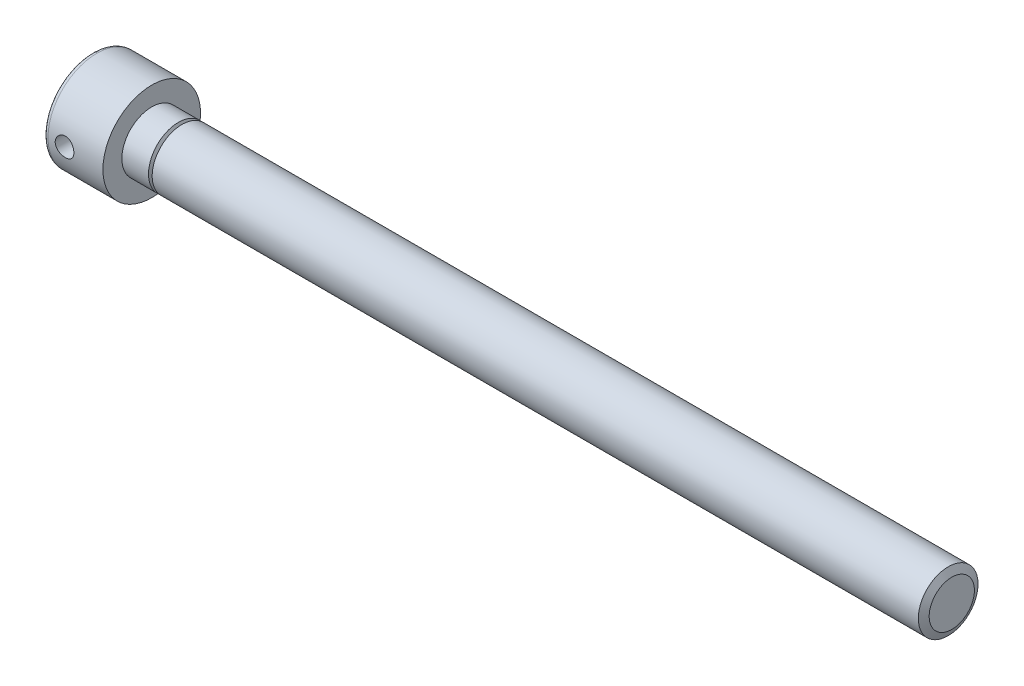
ISO-10303-21;
HEADER;
FILE_DESCRIPTION(('STEP AP214'),'2;1');
FILE_NAME('part.step','',(''),(''),'','','');
FILE_SCHEMA(('AUTOMOTIVE_DESIGN { 1 0 10303 214 1 1 1 1 }'));
ENDSEC;
DATA;
#1=APPLICATION_CONTEXT('core data for automotive mechanical design processes');
#2=APPLICATION_PROTOCOL_DEFINITION('international standard','automotive_design',2000,#1);
#3=PRODUCT_CONTEXT('',#1,'mechanical');
#4=PRODUCT('Part','Part','',(#3));
#5=PRODUCT_RELATED_PRODUCT_CATEGORY('part','',(#4));
#6=PRODUCT_DEFINITION_FORMATION('','',#4);
#7=PRODUCT_DEFINITION_CONTEXT('part definition',#1,'design');
#8=PRODUCT_DEFINITION('design','',#6,#7);
#9=PRODUCT_DEFINITION_SHAPE('','',#8);
#10=(LENGTH_UNIT() NAMED_UNIT(*) SI_UNIT(.MILLI.,.METRE.));
#11=(NAMED_UNIT(*) PLANE_ANGLE_UNIT() SI_UNIT($,.RADIAN.));
#12=(NAMED_UNIT(*) SI_UNIT($,.STERADIAN.) SOLID_ANGLE_UNIT());
#13=UNCERTAINTY_MEASURE_WITH_UNIT(LENGTH_MEASURE(1.E-05),#10,'distance_accuracy_value','');
#14=(GEOMETRIC_REPRESENTATION_CONTEXT(3) GLOBAL_UNCERTAINTY_ASSIGNED_CONTEXT((#13)) GLOBAL_UNIT_ASSIGNED_CONTEXT((#10,
#11,#12)) REPRESENTATION_CONTEXT('',''));
#15=CARTESIAN_POINT('',(0.,0.,0.));
#16=DIRECTION('',(0.,0.,1.));
#17=DIRECTION('',(1.,0.,0.));
#18=AXIS2_PLACEMENT_3D('',#15,#16,#17);
#19=CARTESIAN_POINT('',(-2.8448,0.,0.));
#20=DIRECTION('',(-1.,0.,0.));
#21=DIRECTION('',(0.,0.,1.));
#22=AXIS2_PLACEMENT_3D('',#19,#20,#21);
#23=PLANE('',#22);
#24=CARTESIAN_POINT('',(-2.8448,0.,0.));
#25=DIRECTION('',(-1.,0.,0.));
#26=DIRECTION('',(0.,0.,1.));
#27=AXIS2_PLACEMENT_3D('',#24,#25,#26);
#28=CIRCLE('',#27,2.0955);
#29=CARTESIAN_POINT('',(-2.8448,0.,2.0955));
#30=VERTEX_POINT('',#29);
#31=EDGE_CURVE('E107',#30,#30,#28,.T.);
#32=ORIENTED_EDGE('',*,*,#31,.T.);
#33=EDGE_LOOP('',(#32));
#34=FACE_BOUND('',#33,.T.);
#35=DIRECTION('',(0.,-1.,0.));
#36=VECTOR('',#35,1.);
#37=CARTESIAN_POINT('',(-2.8448,0.,1.1938));
#38=LINE('',#37,#36);
#39=CARTESIAN_POINT('',(-2.8448,0.689240751358576,1.1938));
#40=VERTEX_POINT('',#39);
#41=CARTESIAN_POINT('',(-2.8448,-0.689240751358574,1.1938));
#42=VERTEX_POINT('',#41);
#43=EDGE_CURVE('E135',#40,#42,#38,.T.);
#44=ORIENTED_EDGE('',*,*,#43,.T.);
#45=DIRECTION('',(0.,-0.5,-0.866025403784439));
#46=VECTOR('',#45,1.);
#47=CARTESIAN_POINT('',(-2.8448,-1.03386112703786,0.5969));
#48=LINE('',#47,#46);
#49=CARTESIAN_POINT('',(-2.8448,-1.37848150271715,0.));
#50=VERTEX_POINT('',#49);
#51=EDGE_CURVE('E10',#42,#50,#48,.T.);
#52=ORIENTED_EDGE('',*,*,#51,.T.);
#53=DIRECTION('',(0.,0.5,-0.866025403784439));
#54=VECTOR('',#53,1.);
#55=CARTESIAN_POINT('',(-2.8448,-1.03386112703786,-0.5969));
#56=LINE('',#55,#54);
#57=CARTESIAN_POINT('',(-2.8448,-0.689240751358576,-1.1938));
#58=VERTEX_POINT('',#57);
#59=EDGE_CURVE('E25',#50,#58,#56,.T.);
#60=ORIENTED_EDGE('',*,*,#59,.T.);
#61=DIRECTION('',(0.,1.,0.));
#62=VECTOR('',#61,1.);
#63=CARTESIAN_POINT('',(-2.8448,0.,-1.1938));
#64=LINE('',#63,#62);
#65=CARTESIAN_POINT('',(-2.8448,0.689240751358575,-1.1938));
#66=VERTEX_POINT('',#65);
#67=EDGE_CURVE('E147',#58,#66,#64,.T.);
#68=ORIENTED_EDGE('',*,*,#67,.T.);
#69=DIRECTION('',(0.,0.5,0.866025403784439));
#70=VECTOR('',#69,1.);
#71=CARTESIAN_POINT('',(-2.8448,1.03386112703786,-0.5969));
#72=LINE('',#71,#70);
#73=CARTESIAN_POINT('',(-2.8448,1.37848150271715,0.));
#74=VERTEX_POINT('',#73);
#75=EDGE_CURVE('E143',#66,#74,#72,.T.);
#76=ORIENTED_EDGE('',*,*,#75,.T.);
#77=DIRECTION('',(0.,-0.5,0.866025403784439));
#78=VECTOR('',#77,1.);
#79=CARTESIAN_POINT('',(-2.8448,1.03386112703786,0.5969));
#80=LINE('',#79,#78);
#81=EDGE_CURVE('E139',#74,#40,#80,.T.);
#82=ORIENTED_EDGE('',*,*,#81,.T.);
#83=EDGE_LOOP('',(#44,#52,#60,#68,#76,#82));
#84=FACE_BOUND('',#83,.T.);
#85=ADVANCED_FACE('F15',(#34,#84),#23,.T.);
#86=CARTESIAN_POINT('',(0.,-2.3241,0.));
#87=DIRECTION('',(1.,0.,0.));
#88=DIRECTION('',(0.,0.,-1.));
#89=AXIS2_PLACEMENT_3D('',#86,#87,#88);
#90=PLANE('',#89);
#91=CARTESIAN_POINT('',(0.,0.,0.));
#92=DIRECTION('',(-1.,0.,0.));
#93=DIRECTION('',(0.,0.,1.));
#94=AXIS2_PLACEMENT_3D('',#91,#92,#93);
#95=CIRCLE('',#94,1.4224);
#96=CARTESIAN_POINT('',(0.,0.,1.4224));
#97=VERTEX_POINT('',#96);
#98=EDGE_CURVE('E131',#97,#97,#95,.T.);
#99=ORIENTED_EDGE('',*,*,#98,.T.);
#100=EDGE_LOOP('',(#99));
#101=FACE_BOUND('',#100,.T.);
#102=CARTESIAN_POINT('',(0.,0.,0.));
#103=DIRECTION('',(-1.,0.,0.));
#104=DIRECTION('',(0.,0.,1.));
#105=AXIS2_PLACEMENT_3D('',#102,#103,#104);
#106=CIRCLE('',#105,2.3241);
#107=CARTESIAN_POINT('',(0.,0.,2.3241));
#108=VERTEX_POINT('',#107);
#109=EDGE_CURVE('E89',#108,#108,#106,.T.);
#110=ORIENTED_EDGE('',*,*,#109,.F.);
#111=EDGE_LOOP('',(#110));
#112=FACE_BOUND('',#111,.T.);
#113=ADVANCED_FACE('F17',(#101,#112),#90,.T.);
#114=CARTESIAN_POINT('',(-2.8448,0.,0.));
#115=DIRECTION('',(-1.,0.,0.));
#116=DIRECTION('',(0.,0.,1.));
#117=AXIS2_PLACEMENT_3D('',#114,#115,#116);
#118=CYLINDRICAL_SURFACE('',#117,1.4224);
#119=CARTESIAN_POINT('',(1.27,0.,0.));
#120=DIRECTION('',(-1.,0.,0.));
#121=DIRECTION('',(0.,0.,1.));
#122=AXIS2_PLACEMENT_3D('',#119,#120,#121);
#123=CIRCLE('',#122,1.4224);
#124=CARTESIAN_POINT('',(1.27,0.,1.4224));
#125=VERTEX_POINT('',#124);
#126=EDGE_CURVE('E127',#125,#125,#123,.T.);
#127=ORIENTED_EDGE('',*,*,#126,.T.);
#128=EDGE_LOOP('',(#127));
#129=FACE_BOUND('',#128,.T.);
#130=ORIENTED_EDGE('',*,*,#98,.F.);
#131=EDGE_LOOP('',(#130));
#132=FACE_BOUND('',#131,.T.);
#133=ADVANCED_FACE('F363',(#129,#132),#118,.T.);
#134=CARTESIAN_POINT('',(1.27,0.,0.));
#135=DIRECTION('',(-1.,0.,0.));
#136=DIRECTION('',(0.,0.,1.));
#137=AXIS2_PLACEMENT_3D('',#134,#135,#136);
#138=CONICAL_SURFACE('',#137,1.4224,1.10714871779409);
#139=CARTESIAN_POINT('',(1.442085,0.,0.));
#140=DIRECTION('',(-1.,0.,0.));
#141=DIRECTION('',(0.,0.,1.));
#142=AXIS2_PLACEMENT_3D('',#139,#140,#141);
#143=CIRCLE('',#142,1.07823);
#144=CARTESIAN_POINT('',(1.442085,0.,1.07823));
#145=VERTEX_POINT('',#144);
#146=EDGE_CURVE('E123',#145,#145,#143,.T.);
#147=ORIENTED_EDGE('',*,*,#146,.T.);
#148=EDGE_LOOP('',(#147));
#149=FACE_BOUND('',#148,.T.);
#150=ORIENTED_EDGE('',*,*,#126,.F.);
#151=EDGE_LOOP('',(#150));
#152=FACE_BOUND('',#151,.T.);
#153=ADVANCED_FACE('F352',(#149,#152),#138,.T.);
#154=CARTESIAN_POINT('',(1.442085,-1.07823,0.));
#155=DIRECTION('',(-1.,0.,0.));
#156=DIRECTION('',(0.,0.,1.));
#157=AXIS2_PLACEMENT_3D('',#154,#155,#156);
#158=PLANE('',#157);
#159=CARTESIAN_POINT('',(1.442085,0.,0.));
#160=DIRECTION('',(-1.,0.,0.));
#161=DIRECTION('',(0.,0.,1.));
#162=AXIS2_PLACEMENT_3D('',#159,#160,#161);
#163=CIRCLE('',#162,1.4224);
#164=CARTESIAN_POINT('',(1.442085,0.,1.4224));
#165=VERTEX_POINT('',#164);
#166=EDGE_CURVE('E119',#165,#165,#163,.T.);
#167=ORIENTED_EDGE('',*,*,#166,.T.);
#168=EDGE_LOOP('',(#167));
#169=FACE_BOUND('',#168,.T.);
#170=ORIENTED_EDGE('',*,*,#146,.F.);
#171=EDGE_LOOP('',(#170));
#172=FACE_BOUND('',#171,.T.);
#173=ADVANCED_FACE('F341',(#169,#172),#158,.T.);
#174=CARTESIAN_POINT('',(-2.8448,0.,0.));
#175=DIRECTION('',(-1.,0.,0.));
#176=DIRECTION('',(0.,0.,1.));
#177=AXIS2_PLACEMENT_3D('',#174,#175,#176);
#178=CYLINDRICAL_SURFACE('',#177,1.4224);
#179=CARTESIAN_POINT('',(37.927915,0.,0.));
#180=DIRECTION('',(-1.,0.,0.));
#181=DIRECTION('',(0.,0.,1.));
#182=AXIS2_PLACEMENT_3D('',#179,#180,#181);
#183=CIRCLE('',#182,1.4224);
#184=CARTESIAN_POINT('',(37.927915,0.,1.4224));
#185=VERTEX_POINT('',#184);
#186=EDGE_CURVE('E115',#185,#185,#183,.T.);
#187=ORIENTED_EDGE('',*,*,#186,.T.);
#188=EDGE_LOOP('',(#187));
#189=FACE_BOUND('',#188,.T.);
#190=ORIENTED_EDGE('',*,*,#166,.F.);
#191=EDGE_LOOP('',(#190));
#192=FACE_BOUND('',#191,.T.);
#193=ADVANCED_FACE('F330',(#189,#192),#178,.T.);
#194=CARTESIAN_POINT('',(37.927915,0.,0.));
#195=DIRECTION('',(-1.,0.,0.));
#196=DIRECTION('',(0.,0.,1.));
#197=AXIS2_PLACEMENT_3D('',#194,#195,#196);
#198=CONICAL_SURFACE('',#197,1.4224,1.1071487177941);
#199=CARTESIAN_POINT('',(38.1,0.,0.));
#200=DIRECTION('',(-1.,0.,0.));
#201=DIRECTION('',(0.,0.,1.));
#202=AXIS2_PLACEMENT_3D('',#199,#200,#201);
#203=CIRCLE('',#202,1.07823);
#204=CARTESIAN_POINT('',(38.1,0.,1.07823));
#205=VERTEX_POINT('',#204);
#206=EDGE_CURVE('E111',#205,#205,#203,.T.);
#207=ORIENTED_EDGE('',*,*,#206,.T.);
#208=EDGE_LOOP('',(#207));
#209=FACE_BOUND('',#208,.T.);
#210=ORIENTED_EDGE('',*,*,#186,.F.);
#211=EDGE_LOOP('',(#210));
#212=FACE_BOUND('',#211,.T.);
#213=ADVANCED_FACE('F319',(#209,#212),#198,.T.);
#214=CARTESIAN_POINT('',(38.1,-1.07823,0.));
#215=DIRECTION('',(1.,0.,0.));
#216=DIRECTION('',(0.,0.,-1.));
#217=AXIS2_PLACEMENT_3D('',#214,#215,#216);
#218=PLANE('',#217);
#219=ORIENTED_EDGE('',*,*,#206,.F.);
#220=EDGE_LOOP('',(#219));
#221=FACE_BOUND('',#220,.T.);
#222=ADVANCED_FACE('F308',(#221),#218,.T.);
#223=CARTESIAN_POINT('',(-2.6162,0.,0.));
#224=DIRECTION('',(-1.,0.,0.));
#225=DIRECTION('',(0.,0.,1.));
#226=AXIS2_PLACEMENT_3D('',#223,#224,#225);
#227=TOROIDAL_SURFACE('',#226,2.0955,0.2286);
#228=CARTESIAN_POINT('',(-2.6162,0.,0.));
#229=DIRECTION('',(-1.,0.,0.));
#230=DIRECTION('',(0.,0.,1.));
#231=AXIS2_PLACEMENT_3D('',#228,#229,#230);
#232=CIRCLE('',#231,2.3241);
#233=CARTESIAN_POINT('',(-2.6162,0.,2.3241));
#234=VERTEX_POINT('',#233);
#235=EDGE_CURVE('E97',#234,#234,#232,.T.);
#236=ORIENTED_EDGE('',*,*,#235,.T.);
#237=EDGE_LOOP('',(#236));
#238=FACE_BOUND('',#237,.T.);
#239=ORIENTED_EDGE('',*,*,#31,.F.);
#240=EDGE_LOOP('',(#239));
#241=FACE_BOUND('',#240,.T.);
#242=ADVANCED_FACE('F297',(#238,#241),#227,.T.);
#243=CARTESIAN_POINT('',(-2.8448,0.,0.));
#244=DIRECTION('',(-1.,0.,0.));
#245=DIRECTION('',(0.,0.,1.));
#246=AXIS2_PLACEMENT_3D('',#243,#244,#245);
#247=CYLINDRICAL_SURFACE('',#246,2.3241);
#248=CARTESIAN_POINT('',(-1.3843,0.,2.3241));
#249=CARTESIAN_POINT('',(-1.38430093486755,0.0247261879495477,2.32409954927227));
#250=CARTESIAN_POINT('',(-1.38637013598345,0.0494644362756174,2.32370133868878));
#251=CARTESIAN_POINT('',(-1.39458657435463,0.0982431939285799,2.32215118785473));
#252=CARTESIAN_POINT('',(-1.4007371939632,0.122283107269652,2.32099862246609));
#253=CARTESIAN_POINT('',(-1.41692073872026,0.168952749541908,2.31806862384384));
#254=CARTESIAN_POINT('',(-1.42695009499309,0.191583752670709,2.3162917651677));
#255=CARTESIAN_POINT('',(-1.4505961447561,0.234839899460193,2.31230695462025));
#256=CARTESIAN_POINT('',(-1.4642125705651,0.255465192637639,2.3100990349196));
#257=CARTESIAN_POINT('',(-1.49482594497226,0.294382901657181,2.30546489302863));
#258=CARTESIAN_POINT('',(-1.51185886499462,0.312646767664744,2.30303651282998));
#259=CARTESIAN_POINT('',(-1.54874436154108,0.346076127399492,2.29825106653114));
#260=CARTESIAN_POINT('',(-1.56859714550529,0.361241392981306,2.29589400569295));
#261=CARTESIAN_POINT('',(-1.61076164696033,0.38816262889297,2.29149706938861));
#262=CARTESIAN_POINT('',(-1.63309232063012,0.399889403933258,2.28945997467282));
#263=CARTESIAN_POINT('',(-1.67945233301084,0.419413841498859,2.28596409669431));
#264=CARTESIAN_POINT('',(-1.70348151878521,0.427211857262929,2.28450526144221));
#265=CARTESIAN_POINT('',(-1.75225047164336,0.438565480530308,2.28235283117447));
#266=CARTESIAN_POINT('',(-1.77697822194572,0.442170967230972,2.28165024656355));
#267=CARTESIAN_POINT('',(-1.82669688673606,0.445192039727115,2.28106277705459));
#268=CARTESIAN_POINT('',(-1.85168777643841,0.444608016677317,2.28117781581889));
#269=CARTESIAN_POINT('',(-1.90086090873464,0.439307058879672,2.28220441551788));
#270=CARTESIAN_POINT('',(-1.92504954290731,0.434646977717875,2.28310501878429));
#271=CARTESIAN_POINT('',(-1.97229521831367,0.421415782524894,2.28558404828694));
#272=CARTESIAN_POINT('',(-1.99535220965258,0.412844496217665,2.28716250438025));
#273=CARTESIAN_POINT('',(-2.03984570904388,0.391978984865874,2.29083076794129));
#274=CARTESIAN_POINT('',(-2.06127124182469,0.379661927495011,2.29292369593332));
#275=CARTESIAN_POINT('',(-2.10177278686305,0.351670646572467,2.29738303742556));
#276=CARTESIAN_POINT('',(-2.12084855102172,0.335996068996811,2.29974947975355));
#277=CARTESIAN_POINT('',(-2.1564374282417,0.301428787528978,2.3045368764569));
#278=CARTESIAN_POINT('',(-2.17290333992632,0.282487485499089,2.3069580880374));
#279=CARTESIAN_POINT('',(-2.20243122500809,0.242086717353646,2.31154655587894));
#280=CARTESIAN_POINT('',(-2.2154931616036,0.220627224016625,2.3137138093942));
#281=CARTESIAN_POINT('',(-2.23784979145357,0.175749053688258,2.31755481655435));
#282=CARTESIAN_POINT('',(-2.2471394324729,0.15232779958947,2.31922790755564));
#283=CARTESIAN_POINT('',(-2.26163928550405,0.104218083439616,2.32188698545675));
#284=CARTESIAN_POINT('',(-2.26684994870836,0.0795297618660925,2.32287304835025));
#285=CARTESIAN_POINT('',(-2.27297790380763,0.029992672999654,2.32403648635956));
#286=CARTESIAN_POINT('',(-2.2739598459049,0.00515218005277357,2.32422603773));
#287=CARTESIAN_POINT('',(-2.27177610674673,-0.0443380143980917,2.32380878468609));
#288=CARTESIAN_POINT('',(-2.26861063787157,-0.0689877256065943,2.32320202104937));
#289=CARTESIAN_POINT('',(-2.25827567218944,-0.117190549281871,2.32126790795945));
#290=CARTESIAN_POINT('',(-2.25113902344653,-0.140750962585753,2.31994647248002));
#291=CARTESIAN_POINT('',(-2.23309993021651,-0.186340829275227,2.31673059195665));
#292=CARTESIAN_POINT('',(-2.22219722206942,-0.208370175341808,2.31483610679494));
#293=CARTESIAN_POINT('',(-2.19679335902694,-0.250547529840524,2.31065390498313));
#294=CARTESIAN_POINT('',(-2.18225287117741,-0.270671421736224,2.30836198017262));
#295=CARTESIAN_POINT('',(-2.15003925912195,-0.308216762055864,2.3036496970659));
#296=CARTESIAN_POINT('',(-2.13236582971735,-0.325637946882538,2.30122932627309));
#297=CARTESIAN_POINT('',(-2.09409484726977,-0.357530147315511,2.29649235541527));
#298=CARTESIAN_POINT('',(-2.07346018738169,-0.371956964272113,2.29417765670866));
#299=CARTESIAN_POINT('',(-2.03002235702591,-0.397139750451742,2.28995295704193));
#300=CARTESIAN_POINT('',(-2.00721926914042,-0.407895859398122,2.28804294067885));
#301=CARTESIAN_POINT('',(-1.96020190253759,-0.425369919362874,2.28485891465019));
#302=CARTESIAN_POINT('',(-1.93599525052019,-0.432107793871279,2.28358177244993));
#303=CARTESIAN_POINT('',(-1.88676661677932,-0.441415278307372,2.28180109037161));
#304=CARTESIAN_POINT('',(-1.8617447315702,-0.44398537983599,2.28129745925605));
#305=CARTESIAN_POINT('',(-1.81203893484044,-0.444867396478518,2.28112557959062));
#306=CARTESIAN_POINT('',(-1.78735628160574,-0.443249065240748,2.2814436464224));
#307=CARTESIAN_POINT('',(-1.73862183588461,-0.435953232325106,2.28284891227715));
#308=CARTESIAN_POINT('',(-1.71457003926228,-0.430275757265919,2.28393610625641));
#309=CARTESIAN_POINT('',(-1.66781959103379,-0.415052731833659,2.28675125866519));
#310=CARTESIAN_POINT('',(-1.64511830045289,-0.405515029796836,2.28847791638139));
#311=CARTESIAN_POINT('',(-1.60162705730831,-0.382850027121169,2.29237831119011));
#312=CARTESIAN_POINT('',(-1.58083724744251,-0.369722458778077,2.29455208162181));
#313=CARTESIAN_POINT('',(-1.54141031028048,-0.340009115621822,2.29914407362241));
#314=CARTESIAN_POINT('',(-1.52281173035208,-0.323372689729811,2.30156557369649));
#315=CARTESIAN_POINT('',(-1.4886469940221,-0.287219196844063,2.30635595208282));
#316=CARTESIAN_POINT('',(-1.47308153511208,-0.2677014690802,2.30872481818074));
#317=CARTESIAN_POINT('',(-1.44528737020985,-0.226118787324831,2.31316925511882));
#318=CARTESIAN_POINT('',(-1.43309149866759,-0.204031557778585,2.31524185095666));
#319=CARTESIAN_POINT('',(-1.41260335729292,-0.158088641605201,2.31883110976247));
#320=CARTESIAN_POINT('',(-1.40430746424033,-0.134234620340482,2.32034828844174));
#321=CARTESIAN_POINT('',(-1.3935164122464,-0.0919293624376869,2.32235072183206));
#322=CARTESIAN_POINT('',(-1.39006623879096,-0.0737235998588962,2.32300295726612));
#323=CARTESIAN_POINT('',(-1.38545771393589,-0.0370141390929853,2.32387775921255));
#324=CARTESIAN_POINT('',(-1.38429930014209,-0.0185104490308996,2.32410033742252));
#325=CARTESIAN_POINT('',(-1.3843,0.,2.3241));
#326=B_SPLINE_CURVE_WITH_KNOTS('',3,(#248,#249,#250,#251,#252,#253,#254,#255,#256,#257,#258,
#259,#260,#261,#262,#263,#264,#265,#266,#267,#268,#269,#270,#271,#272,#273,#274,#275,#276,#277,
#278,#279,#280,#281,#282,#283,#284,#285,#286,#287,#288,#289,#290,#291,#292,#293,#294,#295,#296,
#297,#298,#299,#300,#301,#302,#303,#304,#305,#306,#307,#308,#309,#310,#311,#312,#313,#314,#315,
#316,#317,#318,#319,#320,#321,#322,#323,#324,#325),.UNSPECIFIED.,.T.,.F.,(4,2,2,2,2,2,2,2,2,2,2,
2,2,2,2,2,2,2,2,2,2,2,2,2,2,2,2,2,2,2,2,2,2,2,2,2,2,2,4),(0.,0.0741108632781098,
0.148283220543787,0.222387492616689,0.296486236303981,0.37141049281206,0.446340263896097,
0.521888951226711,0.597430844684972,0.67206449896909,0.746691185152356,0.820293271890112,
0.893898600876763,0.967961902711264,1.04203301778332,1.11731990456458,1.19260760526664,
1.26799580883056,1.34337567221679,1.41759891604649,1.49181835920695,1.56543282280502,
1.63905244116058,1.7135053377422,1.78796549121781,1.86345685341259,1.93894534175222,
2.01405635686173,2.08915851176427,2.16301800278419,2.23687700945949,2.3105865996555,
2.38430168803786,2.45916426057073,2.53404402811505,2.60962959654975,2.68514480382047,
2.74062697965054,2.79610764493322),.UNSPECIFIED.);
#327=CARTESIAN_POINT('',(-1.3843,0.,2.3241));
#328=VERTEX_POINT('',#327);
#329=EDGE_CURVE('E85',#328,#328,#326,.T.);
#330=ORIENTED_EDGE('',*,*,#329,.F.);
#331=EDGE_LOOP('',(#330));
#332=FACE_BOUND('',#331,.T.);
#333=CARTESIAN_POINT('',(-1.8288,0.4445,-2.28119717692268));
#334=CARTESIAN_POINT('',(-1.80407847435277,0.444499061456731,-2.28119765992554));
#335=CARTESIAN_POINT('',(-1.77934487818359,0.442430614204679,-2.28160340664396));
#336=CARTESIAN_POINT('',(-1.73057578093452,0.434217441531706,-2.28318042519759));
#337=CARTESIAN_POINT('',(-1.70654087962683,0.428069315965336,-2.28435233556813));
#338=CARTESIAN_POINT('',(-1.65988185034576,0.411893063069742,-2.2873242105894));
#339=CARTESIAN_POINT('',(-1.63725640571407,0.401868621917639,-2.28912357840113));
#340=CARTESIAN_POINT('',(-1.59400962447655,0.378234157314159,-2.29314691710774));
#341=CARTESIAN_POINT('',(-1.57338814478289,0.364624390121407,-2.29537085765345));
#342=CARTESIAN_POINT('',(-1.53446634577937,0.334017832605717,-2.30002491433144));
#343=CARTESIAN_POINT('',(-1.51619573404061,0.316983576153708,-2.30245712324928));
#344=CARTESIAN_POINT('',(-1.48275329318448,0.280092546354547,-2.30723520315865));
#345=CARTESIAN_POINT('',(-1.46758167149086,0.260235584226849,-2.30958106836236));
#346=CARTESIAN_POINT('',(-1.44065361338266,0.218067208125288,-2.31394460970543));
#347=CARTESIAN_POINT('',(-1.42892525208332,0.195737556446755,-2.31595953192487));
#348=CARTESIAN_POINT('',(-1.40939760276585,0.149379756155845,-2.31941071011618));
#349=CARTESIAN_POINT('',(-1.40159797860103,0.125351753056785,-2.32084701559298));
#350=CARTESIAN_POINT('',(-1.39024125150589,0.0765873019574365,-2.32296434491799));
#351=CARTESIAN_POINT('',(-1.38663404273973,0.0518629164953577,-2.32365428196922));
#352=CARTESIAN_POINT('',(-1.38360835906374,0.00215090527482322,-2.32423187703968));
#353=CARTESIAN_POINT('',(-1.3841895136556,-0.0228366970044901,-2.32411960602143));
#354=CARTESIAN_POINT('',(-1.38948575691685,-0.0720220137891947,-2.32311238297186));
#355=CARTESIAN_POINT('',(-1.39414688805173,-0.0962257779041499,-2.32222764714361));
#356=CARTESIAN_POINT('',(-1.40738536136785,-0.143501163472998,-2.31978638059016));
#357=CARTESIAN_POINT('',(-1.41596285048901,-0.166572742411853,-2.31822982465871));
#358=CARTESIAN_POINT('',(-1.43684154780038,-0.211084589786303,-2.31460280802933));
#359=CARTESIAN_POINT('',(-1.44916419866126,-0.232514550430192,-2.3125294007619));
#360=CARTESIAN_POINT('',(-1.4771676054672,-0.27302261510326,-2.30809776603714));
#361=CARTESIAN_POINT('',(-1.49284871618202,-0.292100470332859,-2.30573950850123));
#362=CARTESIAN_POINT('',(-1.52742086017188,-0.327682623188537,-2.30095477885545));
#363=CARTESIAN_POINT('',(-1.5463591044487,-0.344141016708504,-2.29852781867505));
#364=CARTESIAN_POINT('',(-1.58675099933989,-0.373655158241008,-2.29391509241437));
#365=CARTESIAN_POINT('',(-1.60820468976425,-0.386710852391169,-2.29172933015242));
#366=CARTESIAN_POINT('',(-1.65308083493203,-0.409062883285504,-2.28784569427726));
#367=CARTESIAN_POINT('',(-1.67650680621981,-0.41835232578002,-2.28614871703031));
#368=CARTESIAN_POINT('',(-1.72462684015902,-0.432850358368082,-2.28344833652028));
#369=CARTESIAN_POINT('',(-1.74932075246107,-0.438059431116701,-2.28244485122769));
#370=CARTESIAN_POINT('',(-1.79886113970388,-0.444181370311988,-2.28126136269168));
#371=CARTESIAN_POINT('',(-1.82369915875335,-0.44516028668656,-2.28106870046015));
#372=CARTESIAN_POINT('',(-1.87318369717404,-0.442971379923753,-2.28149476590875));
#373=CARTESIAN_POINT('',(-1.89783022635542,-0.439803770643802,-2.28211345174352));
#374=CARTESIAN_POINT('',(-1.94601358793605,-0.429468502798602,-2.28408069265384));
#375=CARTESIAN_POINT('',(-1.96955817237807,-0.422335665532918,-2.28542289101573));
#376=CARTESIAN_POINT('',(-2.0151180527066,-0.404309447561266,-2.2886804197637));
#377=CARTESIAN_POINT('',(-2.03713323177615,-0.393415779979196,-2.29059579387013));
#378=CARTESIAN_POINT('',(-2.07929977460578,-0.368025851716685,-2.29481257292222));
#379=CARTESIAN_POINT('',(-2.09942564115157,-0.353487982747343,-2.29711832891348));
#380=CARTESIAN_POINT('',(-2.13697617050639,-0.321278245543313,-2.30184392112678));
#381=CARTESIAN_POINT('',(-2.15440057986501,-0.303606083582659,-2.30426376802507));
#382=CARTESIAN_POINT('',(-2.1863014180781,-0.265333962988759,-2.30898568485609));
#383=CARTESIAN_POINT('',(-2.20073335537505,-0.244696617375236,-2.31128564216542));
#384=CARTESIAN_POINT('',(-2.22592511448342,-0.201251888560079,-2.31547274468481));
#385=CARTESIAN_POINT('',(-2.23668508160829,-0.178444591277141,-2.31735990622968));
#386=CARTESIAN_POINT('',(-2.25416137597155,-0.131428544249365,-2.32049971880432));
#387=CARTESIAN_POINT('',(-2.26089928004312,-0.107228050463611,-2.32175574975188));
#388=CARTESIAN_POINT('',(-2.27020890392427,-0.0580125395120532,-2.32350622214802));
#389=CARTESIAN_POINT('',(-2.27278108067732,-0.0329976119895404,-2.32400074712679));
#390=CARTESIAN_POINT('',(-2.273669799336,0.0167105156329233,-2.32417073463421));
#391=CARTESIAN_POINT('',(-2.27205344774595,0.0414024966996732,-2.32385911297723));
#392=CARTESIAN_POINT('',(-2.26475831800239,0.090156125100985,-2.32247875345601));
#393=CARTESIAN_POINT('',(-2.25907958224134,0.114217779010522,-2.32141002349249));
#394=CARTESIAN_POINT('',(-2.2438496228376,0.160990391092384,-2.31863563395371));
#395=CARTESIAN_POINT('',(-2.23430581420234,0.183703840615695,-2.31693119445713));
#396=CARTESIAN_POINT('',(-2.2116247921413,0.227216900062015,-2.31306960307557));
#397=CARTESIAN_POINT('',(-2.19848732502293,0.248016374730301,-2.31091241923182));
#398=CARTESIAN_POINT('',(-2.16876227869123,0.287444709207981,-2.30634269283359));
#399=CARTESIAN_POINT('',(-2.15212635483327,0.30603674172063,-2.30392683343554));
#400=CARTESIAN_POINT('',(-2.11597666380038,0.340188500946385,-2.29913260308203));
#401=CARTESIAN_POINT('',(-2.09646221952076,0.355747512207564,-2.29675424109307));
#402=CARTESIAN_POINT('',(-2.05488296259398,0.383533730175263,-2.29227904649457));
#403=CARTESIAN_POINT('',(-2.03279526550165,0.395727184566284,-2.2901851657826));
#404=CARTESIAN_POINT('',(-1.98685155766996,0.416210682251051,-2.28655167867123));
#405=CARTESIAN_POINT('',(-1.96299722123901,0.424504368060152,-2.28501155536151));
#406=CARTESIAN_POINT('',(-1.92069765529225,0.435289985884959,-2.28297708482509));
#407=CARTESIAN_POINT('',(-1.90249825524282,0.438737746016125,-2.28231363362375));
#408=CARTESIAN_POINT('',(-1.8658014851711,0.443343070844551,-2.28142350529326));
#409=CARTESIAN_POINT('',(-1.84730412387673,0.444500702501988,-2.28119681539383));
#410=CARTESIAN_POINT('',(-1.8288,0.4445,-2.28119717692268));
#411=B_SPLINE_CURVE_WITH_KNOTS('',3,(#333,#334,#335,#336,#337,#338,#339,#340,#341,#342,#343,
#344,#345,#346,#347,#348,#349,#350,#351,#352,#353,#354,#355,#356,#357,#358,#359,#360,#361,#362,
#363,#364,#365,#366,#367,#368,#369,#370,#371,#372,#373,#374,#375,#376,#377,#378,#379,#380,#381,
#382,#383,#384,#385,#386,#387,#388,#389,#390,#391,#392,#393,#394,#395,#396,#397,#398,#399,#400,
#401,#402,#403,#404,#405,#406,#407,#408,#409,#410),.UNSPECIFIED.,.T.,.F.,(4,2,2,2,2,2,2,2,2,2,2,
2,2,2,2,2,2,2,2,2,2,2,2,2,2,2,2,2,2,2,2,2,2,2,2,2,2,2,4),(0.,0.0740968503337658,
0.148255533247728,0.222343867803858,0.29642690838512,0.371369504993112,0.446317116068702,
0.521859853619328,0.597396126559341,0.672020026586024,0.746637325540573,0.820282474308219,
0.89393038643487,0.968008172530782,1.04209378767131,1.1173611244417,1.19262965256954,
1.2680353468385,1.34343212023964,1.41764729016018,1.49185863257755,1.5654283421883,
1.63900366493621,1.71346069940044,1.78792471519391,1.86342699216814,1.93892628089162,
2.01401681730254,2.0890991163873,2.16298594864764,2.23687200988344,2.31061698974445,
2.38436717694105,2.45921273728305,2.53407593145287,2.60966467769837,2.68518268056749,
2.74064598035581,2.79610765845031),.UNSPECIFIED.);
#412=CARTESIAN_POINT('',(-1.8288,0.4445,-2.28119717692268));
#413=VERTEX_POINT('',#412);
#414=EDGE_CURVE('E405',#413,#413,#411,.T.);
#415=ORIENTED_EDGE('',*,*,#414,.F.);
#416=EDGE_LOOP('',(#415));
#417=FACE_BOUND('',#416,.T.);
#418=ORIENTED_EDGE('',*,*,#109,.T.);
#419=EDGE_LOOP('',(#418));
#420=FACE_BOUND('',#419,.T.);
#421=ORIENTED_EDGE('',*,*,#235,.F.);
#422=EDGE_LOOP('',(#421));
#423=FACE_BOUND('',#422,.T.);
#424=ADVANCED_FACE('F287',(#332,#417,#420,#423),#247,.T.);
#425=CARTESIAN_POINT('',(-1.22555,-0.689240751358574,1.1938));
#426=DIRECTION('',(0.,0.866025403784438,-0.5));
#427=DIRECTION('',(0.,0.5,0.866025403784439));
#428=AXIS2_PLACEMENT_3D('',#425,#426,#427);
#429=PLANE('',#428);
#430=DIRECTION('',(-1.,0.,0.));
#431=VECTOR('',#430,1.);
#432=CARTESIAN_POINT('',(-1.22555,-0.689240751358574,1.1938));
#433=LINE('',#432,#431);
#434=CARTESIAN_POINT('',(-1.22555,-0.689240751358574,1.1938));
#435=VERTEX_POINT('',#434);
#436=EDGE_CURVE('E32',#435,#42,#433,.T.);
#437=ORIENTED_EDGE('',*,*,#436,.F.);
#438=DIRECTION('',(0.,-0.5,-0.866025403784439));
#439=VECTOR('',#438,1.);
#440=CARTESIAN_POINT('',(-1.22555,-0.689240751358574,1.1938));
#441=LINE('',#440,#439);
#442=CARTESIAN_POINT('',(-1.22555,-1.37848150271715,0.));
#443=VERTEX_POINT('',#442);
#444=EDGE_CURVE('E75',#435,#443,#441,.T.);
#445=ORIENTED_EDGE('',*,*,#444,.T.);
#446=DIRECTION('',(-1.,0.,0.));
#447=VECTOR('',#446,1.);
#448=CARTESIAN_POINT('',(-1.22555,-1.37848150271715,0.));
#449=LINE('',#448,#447);
#450=EDGE_CURVE('E83',#443,#50,#449,.T.);
#451=ORIENTED_EDGE('',*,*,#450,.T.);
#452=ORIENTED_EDGE('',*,*,#51,.F.);
#453=EDGE_LOOP('',(#437,#445,#451,#452));
#454=FACE_BOUND('',#453,.T.);
#455=ADVANCED_FACE('F82',(#454),#429,.T.);
#456=CARTESIAN_POINT('',(-1.22555,-1.37848150271715,0.));
#457=DIRECTION('',(0.,0.866025403784439,0.5));
#458=DIRECTION('',(0.,-0.5,0.866025403784439));
#459=AXIS2_PLACEMENT_3D('',#456,#457,#458);
#460=PLANE('',#459);
#461=ORIENTED_EDGE('',*,*,#450,.F.);
#462=DIRECTION('',(0.,0.5,-0.866025403784439));
#463=VECTOR('',#462,1.);
#464=CARTESIAN_POINT('',(-1.22555,-1.37848150271715,0.));
#465=LINE('',#464,#463);
#466=CARTESIAN_POINT('',(-1.22555,-0.689240751358576,-1.1938));
#467=VERTEX_POINT('',#466);
#468=EDGE_CURVE('E71',#443,#467,#465,.T.);
#469=ORIENTED_EDGE('',*,*,#468,.T.);
#470=DIRECTION('',(-1.,0.,0.));
#471=VECTOR('',#470,1.);
#472=CARTESIAN_POINT('',(-1.22555,-0.689240751358576,-1.1938));
#473=LINE('',#472,#471);
#474=EDGE_CURVE('E90',#467,#58,#473,.T.);
#475=ORIENTED_EDGE('',*,*,#474,.T.);
#476=ORIENTED_EDGE('',*,*,#59,.F.);
#477=EDGE_LOOP('',(#461,#469,#475,#476));
#478=FACE_BOUND('',#477,.T.);
#479=ADVANCED_FACE('F87',(#478),#460,.T.);
#480=CARTESIAN_POINT('',(-1.22555,-0.689240751358576,-1.1938));
#481=DIRECTION('',(0.,0.,1.));
#482=DIRECTION('',(0.,-1.,0.));
#483=AXIS2_PLACEMENT_3D('',#480,#481,#482);
#484=PLANE('',#483);
#485=CARTESIAN_POINT('',(-1.8288,0.,-1.1938));
#486=DIRECTION('',(0.,0.,1.));
#487=DIRECTION('',(0.,-1.,0.));
#488=AXIS2_PLACEMENT_3D('',#485,#486,#487);
#489=CIRCLE('',#488,0.4445);
#490=CARTESIAN_POINT('',(-1.8288,-0.4445,-1.1938));
#491=VERTEX_POINT('',#490);
#492=EDGE_CURVE('E420',#491,#491,#489,.T.);
#493=ORIENTED_EDGE('',*,*,#492,.F.);
#494=EDGE_LOOP('',(#493));
#495=FACE_BOUND('',#494,.T.);
#496=ORIENTED_EDGE('',*,*,#474,.F.);
#497=DIRECTION('',(0.,1.,0.));
#498=VECTOR('',#497,1.);
#499=CARTESIAN_POINT('',(-1.22555,-0.689240751358576,-1.1938));
#500=LINE('',#499,#498);
#501=CARTESIAN_POINT('',(-1.22555,0.689240751358575,-1.1938));
#502=VERTEX_POINT('',#501);
#503=EDGE_CURVE('E77',#467,#502,#500,.T.);
#504=ORIENTED_EDGE('',*,*,#503,.T.);
#505=DIRECTION('',(-1.,0.,0.));
#506=VECTOR('',#505,1.);
#507=CARTESIAN_POINT('',(-1.22555,0.689240751358575,-1.1938));
#508=LINE('',#507,#506);
#509=EDGE_CURVE('E100',#502,#66,#508,.T.);
#510=ORIENTED_EDGE('',*,*,#509,.T.);
#511=ORIENTED_EDGE('',*,*,#67,.F.);
#512=EDGE_LOOP('',(#496,#504,#510,#511));
#513=FACE_BOUND('',#512,.T.);
#514=ADVANCED_FACE('F182',(#495,#513),#484,.T.);
#515=CARTESIAN_POINT('',(-1.22555,0.689240751358575,-1.1938));
#516=DIRECTION('',(0.,-0.866025403784439,0.5));
#517=DIRECTION('',(0.,-0.5,-0.866025403784439));
#518=AXIS2_PLACEMENT_3D('',#515,#516,#517);
#519=PLANE('',#518);
#520=ORIENTED_EDGE('',*,*,#509,.F.);
#521=DIRECTION('',(0.,0.5,0.866025403784439));
#522=VECTOR('',#521,1.);
#523=CARTESIAN_POINT('',(-1.22555,0.689240751358575,-1.1938));
#524=LINE('',#523,#522);
#525=CARTESIAN_POINT('',(-1.22555,1.37848150271715,0.));
#526=VERTEX_POINT('',#525);
#527=EDGE_CURVE('E185',#502,#526,#524,.T.);
#528=ORIENTED_EDGE('',*,*,#527,.T.);
#529=DIRECTION('',(-1.,0.,0.));
#530=VECTOR('',#529,1.);
#531=CARTESIAN_POINT('',(-1.22555,1.37848150271715,0.));
#532=LINE('',#531,#530);
#533=EDGE_CURVE('E165',#526,#74,#532,.T.);
#534=ORIENTED_EDGE('',*,*,#533,.T.);
#535=ORIENTED_EDGE('',*,*,#75,.F.);
#536=EDGE_LOOP('',(#520,#528,#534,#535));
#537=FACE_BOUND('',#536,.T.);
#538=ADVANCED_FACE('F184',(#537),#519,.T.);
#539=CARTESIAN_POINT('',(-1.22555,1.37848150271715,0.));
#540=DIRECTION('',(0.,-0.866025403784439,-0.5));
#541=DIRECTION('',(0.,0.5,-0.866025403784439));
#542=AXIS2_PLACEMENT_3D('',#539,#540,#541);
#543=PLANE('',#542);
#544=ORIENTED_EDGE('',*,*,#533,.F.);
#545=DIRECTION('',(0.,-0.5,0.866025403784439));
#546=VECTOR('',#545,1.);
#547=CARTESIAN_POINT('',(-1.22555,1.37848150271715,0.));
#548=LINE('',#547,#546);
#549=CARTESIAN_POINT('',(-1.22555,0.689240751358576,1.1938));
#550=VERTEX_POINT('',#549);
#551=EDGE_CURVE('E163',#526,#550,#548,.T.);
#552=ORIENTED_EDGE('',*,*,#551,.T.);
#553=DIRECTION('',(-1.,0.,0.));
#554=VECTOR('',#553,1.);
#555=CARTESIAN_POINT('',(-1.22555,0.689240751358576,1.1938));
#556=LINE('',#555,#554);
#557=EDGE_CURVE('E157',#550,#40,#556,.T.);
#558=ORIENTED_EDGE('',*,*,#557,.T.);
#559=ORIENTED_EDGE('',*,*,#81,.F.);
#560=EDGE_LOOP('',(#544,#552,#558,#559));
#561=FACE_BOUND('',#560,.T.);
#562=ADVANCED_FACE('F160',(#561),#543,.T.);
#563=CARTESIAN_POINT('',(-1.22555,0.689240751358576,1.1938));
#564=DIRECTION('',(0.,0.,-1.));
#565=DIRECTION('',(0.,1.,0.));
#566=AXIS2_PLACEMENT_3D('',#563,#564,#565);
#567=PLANE('',#566);
#568=CARTESIAN_POINT('',(-1.8288,0.,1.1938));
#569=DIRECTION('',(0.,0.,-1.));
#570=DIRECTION('',(0.,1.,0.));
#571=AXIS2_PLACEMENT_3D('',#568,#569,#570);
#572=CIRCLE('',#571,0.4445);
#573=CARTESIAN_POINT('',(-1.8288,0.4445,1.1938));
#574=VERTEX_POINT('',#573);
#575=EDGE_CURVE('E19',#574,#574,#572,.T.);
#576=ORIENTED_EDGE('',*,*,#575,.F.);
#577=EDGE_LOOP('',(#576));
#578=FACE_BOUND('',#577,.T.);
#579=ORIENTED_EDGE('',*,*,#557,.F.);
#580=DIRECTION('',(0.,-1.,0.));
#581=VECTOR('',#580,1.);
#582=CARTESIAN_POINT('',(-1.22555,0.689240751358576,1.1938));
#583=LINE('',#582,#581);
#584=EDGE_CURVE('E173',#550,#435,#583,.T.);
#585=ORIENTED_EDGE('',*,*,#584,.T.);
#586=ORIENTED_EDGE('',*,*,#436,.T.);
#587=ORIENTED_EDGE('',*,*,#43,.F.);
#588=EDGE_LOOP('',(#579,#585,#586,#587));
#589=FACE_BOUND('',#588,.T.);
#590=ADVANCED_FACE('F156',(#578,#589),#567,.T.);
#591=CARTESIAN_POINT('',(-1.22555,-0.689240751358574,1.1938));
#592=DIRECTION('',(-1.,0.,0.));
#593=DIRECTION('',(0.,0.,-1.));
#594=AXIS2_PLACEMENT_3D('',#591,#592,#593);
#595=PLANE('',#594);
#596=ORIENTED_EDGE('',*,*,#444,.F.);
#597=ORIENTED_EDGE('',*,*,#584,.F.);
#598=ORIENTED_EDGE('',*,*,#551,.F.);
#599=ORIENTED_EDGE('',*,*,#527,.F.);
#600=ORIENTED_EDGE('',*,*,#503,.F.);
#601=ORIENTED_EDGE('',*,*,#468,.F.);
#602=EDGE_LOOP('',(#596,#597,#598,#599,#600,#601));
#603=FACE_BOUND('',#602,.T.);
#604=ADVANCED_FACE('F73',(#603),#595,.T.);
#605=CARTESIAN_POINT('',(-1.8288,0.,-2.4241));
#606=DIRECTION('',(0.,0.,1.));
#607=DIRECTION('',(0.,1.,0.));
#608=AXIS2_PLACEMENT_3D('',#605,#606,#607);
#609=CYLINDRICAL_SURFACE('',#608,0.4445);
#610=ORIENTED_EDGE('',*,*,#329,.T.);
#611=EDGE_LOOP('',(#610));
#612=FACE_BOUND('',#611,.T.);
#613=ORIENTED_EDGE('',*,*,#575,.T.);
#614=EDGE_LOOP('',(#613));
#615=FACE_BOUND('',#614,.T.);
#616=ADVANCED_FACE('F203',(#612,#615),#609,.F.);
#617=ORIENTED_EDGE('',*,*,#414,.T.);
#618=EDGE_LOOP('',(#617));
#619=FACE_BOUND('',#618,.T.);
#620=ORIENTED_EDGE('',*,*,#492,.T.);
#621=EDGE_LOOP('',(#620));
#622=FACE_BOUND('',#621,.T.);
#623=ADVANCED_FACE('F214',(#619,#622),#609,.F.);
#624=CLOSED_SHELL('',(#85,#113,#133,#153,#173,#193,#213,#222,#242,#424,#455,#479,#514,#538,#562,
#590,#604,#616,#623));
#625=MANIFOLD_SOLID_BREP('B1',#624);
#626=ADVANCED_BREP_SHAPE_REPRESENTATION('',(#18,#625),#14);
#627=SHAPE_DEFINITION_REPRESENTATION(#9,#626);
ENDSEC;
END-ISO-10303-21;
